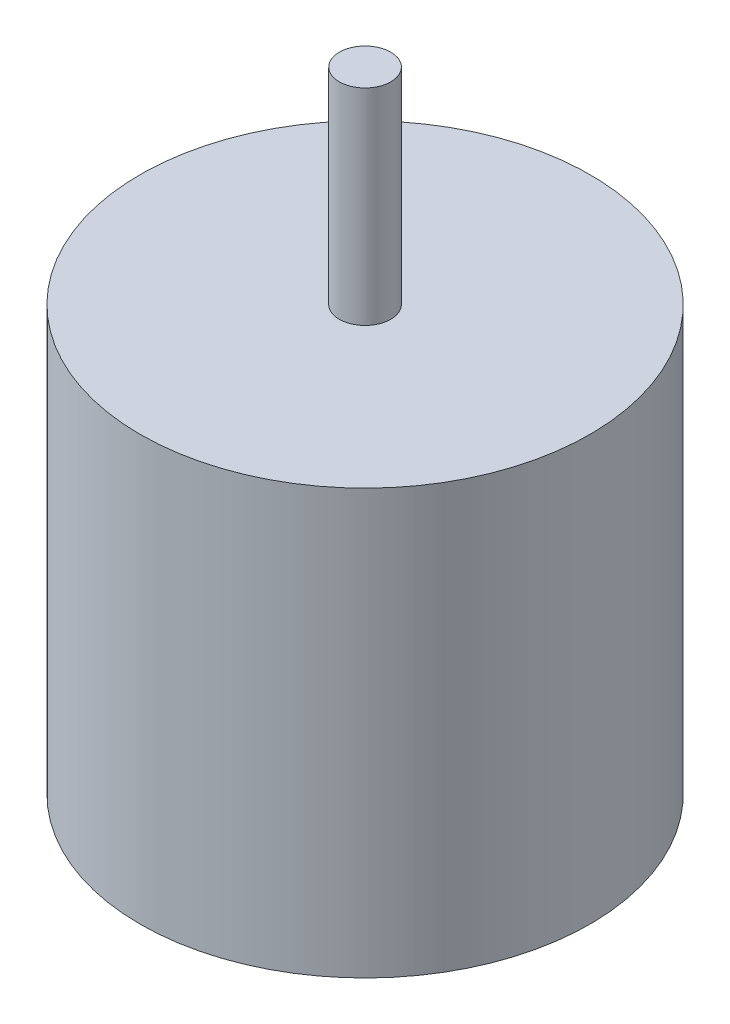
ISO-10303-21;
HEADER;
FILE_DESCRIPTION(('STEP AP214'),'2;1');
FILE_NAME('part.step','',(''),(''),'','','');
FILE_SCHEMA(('AUTOMOTIVE_DESIGN { 1 0 10303 214 1 1 1 1 }'));
ENDSEC;
DATA;
#1=APPLICATION_CONTEXT('core data for automotive mechanical design processes');
#2=APPLICATION_PROTOCOL_DEFINITION('international standard','automotive_design',2000,#1);
#3=PRODUCT_CONTEXT('',#1,'mechanical');
#4=PRODUCT('Part','Part','',(#3));
#5=PRODUCT_RELATED_PRODUCT_CATEGORY('part','',(#4));
#6=PRODUCT_DEFINITION_FORMATION('','',#4);
#7=PRODUCT_DEFINITION_CONTEXT('part definition',#1,'design');
#8=PRODUCT_DEFINITION('design','',#6,#7);
#9=PRODUCT_DEFINITION_SHAPE('','',#8);
#10=(LENGTH_UNIT() NAMED_UNIT(*) SI_UNIT(.MILLI.,.METRE.));
#11=(NAMED_UNIT(*) PLANE_ANGLE_UNIT() SI_UNIT($,.RADIAN.));
#12=(NAMED_UNIT(*) SI_UNIT($,.STERADIAN.) SOLID_ANGLE_UNIT());
#13=UNCERTAINTY_MEASURE_WITH_UNIT(LENGTH_MEASURE(1.E-05),#10,'distance_accuracy_value','');
#14=(GEOMETRIC_REPRESENTATION_CONTEXT(3) GLOBAL_UNCERTAINTY_ASSIGNED_CONTEXT((#13)) GLOBAL_UNIT_ASSIGNED_CONTEXT((#10,
#11,#12)) REPRESENTATION_CONTEXT('',''));
#15=CARTESIAN_POINT('',(0.,0.,0.));
#16=DIRECTION('',(0.,0.,1.));
#17=DIRECTION('',(1.,0.,0.));
#18=AXIS2_PLACEMENT_3D('',#15,#16,#17);
#19=CARTESIAN_POINT('',(0.,33.,0.));
#20=DIRECTION('',(0.,-1.,0.));
#21=DIRECTION('',(0.,0.,-1.));
#22=AXIS2_PLACEMENT_3D('',#19,#20,#21);
#23=CYLINDRICAL_SURFACE('',#22,17.5);
#24=CARTESIAN_POINT('',(0.,33.,0.));
#25=DIRECTION('',(0.,1.,0.));
#26=DIRECTION('',(0.,0.,1.));
#27=AXIS2_PLACEMENT_3D('',#24,#25,#26);
#28=CIRCLE('',#27,17.5);
#29=CARTESIAN_POINT('',(0.,33.,17.5));
#30=VERTEX_POINT('',#29);
#31=EDGE_CURVE('E10',#30,#30,#28,.T.);
#32=ORIENTED_EDGE('',*,*,#31,.F.);
#33=EDGE_LOOP('',(#32));
#34=FACE_BOUND('',#33,.T.);
#35=CARTESIAN_POINT('',(0.,0.,0.));
#36=DIRECTION('',(0.,1.,0.));
#37=DIRECTION('',(0.,0.,1.));
#38=AXIS2_PLACEMENT_3D('',#35,#36,#37);
#39=CIRCLE('',#38,17.5);
#40=CARTESIAN_POINT('',(0.,0.,17.5));
#41=VERTEX_POINT('',#40);
#42=EDGE_CURVE('E40',#41,#41,#39,.T.);
#43=ORIENTED_EDGE('',*,*,#42,.T.);
#44=EDGE_LOOP('',(#43));
#45=FACE_BOUND('',#44,.T.);
#46=ADVANCED_FACE('F37',(#34,#45),#23,.T.);
#47=CARTESIAN_POINT('',(0.,33.,0.));
#48=DIRECTION('',(0.,1.,0.));
#49=DIRECTION('',(0.,0.,1.));
#50=AXIS2_PLACEMENT_3D('',#47,#48,#49);
#51=PLANE('',#50);
#52=CARTESIAN_POINT('',(0.,33.,0.));
#53=DIRECTION('',(0.,1.,0.));
#54=DIRECTION('',(0.,0.,1.));
#55=AXIS2_PLACEMENT_3D('',#52,#53,#54);
#56=CIRCLE('',#55,2.);
#57=CARTESIAN_POINT('',(0.,33.,2.));
#58=VERTEX_POINT('',#57);
#59=EDGE_CURVE('E51',#58,#58,#56,.T.);
#60=ORIENTED_EDGE('',*,*,#59,.F.);
#61=EDGE_LOOP('',(#60));
#62=FACE_BOUND('',#61,.T.);
#63=ORIENTED_EDGE('',*,*,#31,.T.);
#64=EDGE_LOOP('',(#63));
#65=FACE_BOUND('',#64,.T.);
#66=ADVANCED_FACE('F68',(#62,#65),#51,.T.);
#67=CARTESIAN_POINT('',(0.,0.,0.));
#68=DIRECTION('',(0.,1.,0.));
#69=DIRECTION('',(0.,0.,1.));
#70=AXIS2_PLACEMENT_3D('',#67,#68,#69);
#71=PLANE('',#70);
#72=ORIENTED_EDGE('',*,*,#42,.F.);
#73=EDGE_LOOP('',(#72));
#74=FACE_BOUND('',#73,.T.);
#75=ADVANCED_FACE('F64',(#74),#71,.F.);
#76=CARTESIAN_POINT('',(0.,49.,0.));
#77=DIRECTION('',(0.,-1.,0.));
#78=DIRECTION('',(0.,0.,-1.));
#79=AXIS2_PLACEMENT_3D('',#76,#77,#78);
#80=CYLINDRICAL_SURFACE('',#79,2.);
#81=CARTESIAN_POINT('',(0.,49.,0.));
#82=DIRECTION('',(0.,1.,0.));
#83=DIRECTION('',(0.,0.,1.));
#84=AXIS2_PLACEMENT_3D('',#81,#82,#83);
#85=CIRCLE('',#84,2.);
#86=CARTESIAN_POINT('',(0.,49.,2.));
#87=VERTEX_POINT('',#86);
#88=EDGE_CURVE('E49',#87,#87,#85,.T.);
#89=ORIENTED_EDGE('',*,*,#88,.F.);
#90=EDGE_LOOP('',(#89));
#91=FACE_BOUND('',#90,.T.);
#92=ORIENTED_EDGE('',*,*,#59,.T.);
#93=EDGE_LOOP('',(#92));
#94=FACE_BOUND('',#93,.T.);
#95=ADVANCED_FACE('F61',(#91,#94),#80,.T.);
#96=CARTESIAN_POINT('',(0.,49.,0.));
#97=DIRECTION('',(0.,1.,0.));
#98=DIRECTION('',(0.,0.,1.));
#99=AXIS2_PLACEMENT_3D('',#96,#97,#98);
#100=PLANE('',#99);
#101=ORIENTED_EDGE('',*,*,#88,.T.);
#102=EDGE_LOOP('',(#101));
#103=FACE_BOUND('',#102,.T.);
#104=ADVANCED_FACE('F59',(#103),#100,.T.);
#105=CLOSED_SHELL('',(#46,#66,#75,#95,#104));
#106=MANIFOLD_SOLID_BREP('B2',#105);
#107=ADVANCED_BREP_SHAPE_REPRESENTATION('',(#18,#106),#14);
#108=SHAPE_DEFINITION_REPRESENTATION(#9,#107);
ENDSEC;
END-ISO-10303-21;
